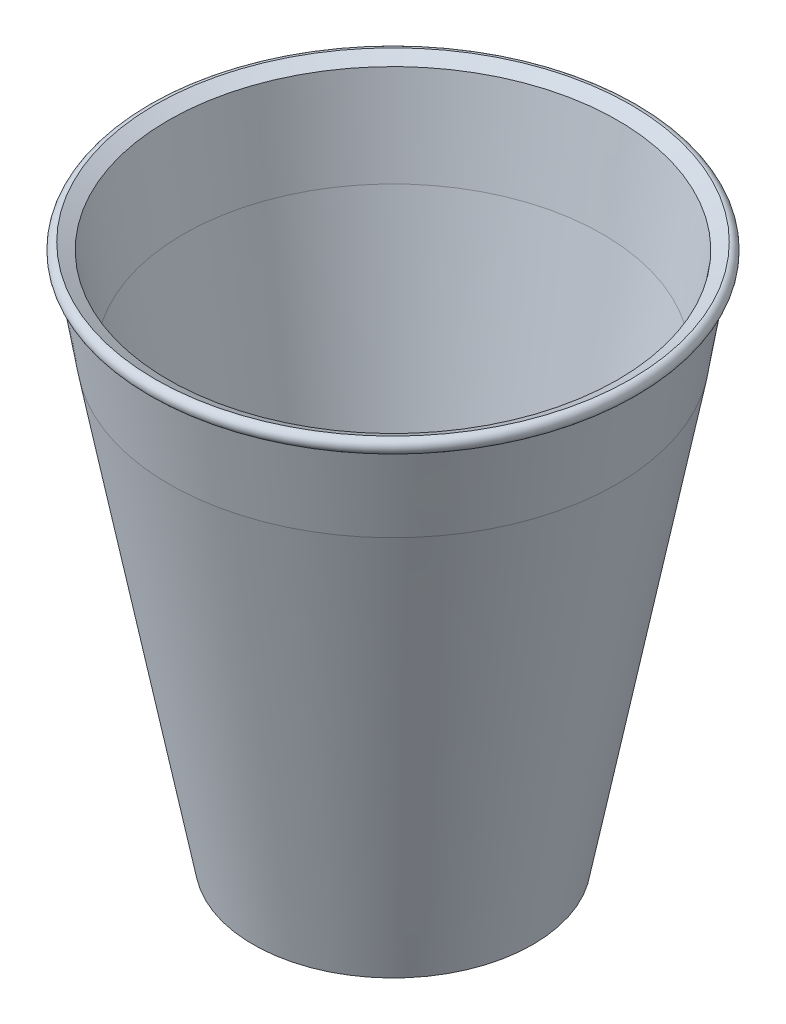
ISO-10303-21;
HEADER;
FILE_DESCRIPTION(('STEP AP214'),'2;1');
FILE_NAME('part.step','',(''),(''),'','','');
FILE_SCHEMA(('AUTOMOTIVE_DESIGN { 1 0 10303 214 1 1 1 1 }'));
ENDSEC;
DATA;
#1=APPLICATION_CONTEXT('core data for automotive mechanical design processes');
#2=APPLICATION_PROTOCOL_DEFINITION('international standard','automotive_design',2000,#1);
#3=PRODUCT_CONTEXT('',#1,'mechanical');
#4=PRODUCT('Part','Part','',(#3));
#5=PRODUCT_RELATED_PRODUCT_CATEGORY('part','',(#4));
#6=PRODUCT_DEFINITION_FORMATION('','',#4);
#7=PRODUCT_DEFINITION_CONTEXT('part definition',#1,'design');
#8=PRODUCT_DEFINITION('design','',#6,#7);
#9=PRODUCT_DEFINITION_SHAPE('','',#8);
#10=(LENGTH_UNIT() NAMED_UNIT(*) SI_UNIT(.MILLI.,.METRE.));
#11=(NAMED_UNIT(*) PLANE_ANGLE_UNIT() SI_UNIT($,.RADIAN.));
#12=(NAMED_UNIT(*) SI_UNIT($,.STERADIAN.) SOLID_ANGLE_UNIT());
#13=UNCERTAINTY_MEASURE_WITH_UNIT(LENGTH_MEASURE(1.E-05),#10,'distance_accuracy_value','');
#14=(GEOMETRIC_REPRESENTATION_CONTEXT(3) GLOBAL_UNCERTAINTY_ASSIGNED_CONTEXT((#13)) GLOBAL_UNIT_ASSIGNED_CONTEXT((#10,
#11,#12)) REPRESENTATION_CONTEXT('',''));
#15=CARTESIAN_POINT('',(0.,0.,0.));
#16=DIRECTION('',(0.,0.,1.));
#17=DIRECTION('',(1.,0.,0.));
#18=AXIS2_PLACEMENT_3D('',#15,#16,#17);
#19=CARTESIAN_POINT('',(-12.6,-75.97,0.));
#20=DIRECTION('',(0.,-1.,0.));
#21=DIRECTION('',(1.,0.,0.));
#22=AXIS2_PLACEMENT_3D('',#19,#20,#21);
#23=PLANE('',#22);
#24=CARTESIAN_POINT('',(0.,-75.97,0.));
#25=DIRECTION('',(0.,1.,0.));
#26=DIRECTION('',(-1.,0.,0.));
#27=AXIS2_PLACEMENT_3D('',#24,#25,#26);
#28=CIRCLE('',#27,12.6);
#29=CARTESIAN_POINT('',(-12.6,-75.97,0.));
#30=VERTEX_POINT('',#29);
#31=EDGE_CURVE('E10',#30,#30,#28,.T.);
#32=ORIENTED_EDGE('',*,*,#31,.F.);
#33=EDGE_LOOP('',(#32));
#34=FACE_BOUND('',#33,.T.);
#35=ADVANCED_FACE('F41',(#34),#23,.T.);
#36=CARTESIAN_POINT('',(0.,0.,0.));
#37=DIRECTION('',(0.,1.,0.));
#38=DIRECTION('',(-1.,0.,0.));
#39=AXIS2_PLACEMENT_3D('',#36,#37,#38);
#40=CYLINDRICAL_SURFACE('',#39,12.6);
#41=ORIENTED_EDGE('',*,*,#31,.T.);
#42=EDGE_LOOP('',(#41));
#43=FACE_BOUND('',#42,.T.);
#44=CARTESIAN_POINT('',(0.,-77.,0.));
#45=DIRECTION('',(0.,1.,0.));
#46=DIRECTION('',(-1.,0.,0.));
#47=AXIS2_PLACEMENT_3D('',#44,#45,#46);
#48=CIRCLE('',#47,12.6);
#49=CARTESIAN_POINT('',(-12.6,-77.,0.));
#50=VERTEX_POINT('',#49);
#51=EDGE_CURVE('E48',#50,#50,#48,.T.);
#52=ORIENTED_EDGE('',*,*,#51,.F.);
#53=EDGE_LOOP('',(#52));
#54=FACE_BOUND('',#53,.T.);
#55=ADVANCED_FACE('F101',(#43,#54),#40,.F.);
#56=CARTESIAN_POINT('',(-20.,-77.,0.));
#57=DIRECTION('',(0.,-1.,0.));
#58=DIRECTION('',(1.,0.,0.));
#59=AXIS2_PLACEMENT_3D('',#56,#57,#58);
#60=PLANE('',#59);
#61=ORIENTED_EDGE('',*,*,#51,.T.);
#62=EDGE_LOOP('',(#61));
#63=FACE_BOUND('',#62,.T.);
#64=CARTESIAN_POINT('',(0.,-77.,0.));
#65=DIRECTION('',(0.,1.,0.));
#66=DIRECTION('',(-1.,0.,0.));
#67=AXIS2_PLACEMENT_3D('',#64,#65,#66);
#68=CIRCLE('',#67,20.);
#69=CARTESIAN_POINT('',(-20.,-77.,0.));
#70=VERTEX_POINT('',#69);
#71=EDGE_CURVE('E53',#70,#70,#68,.T.);
#72=ORIENTED_EDGE('',*,*,#71,.F.);
#73=EDGE_LOOP('',(#72));
#74=FACE_BOUND('',#73,.T.);
#75=ADVANCED_FACE('F106',(#63,#74),#60,.T.);
#76=CARTESIAN_POINT('',(0.,-14.,0.));
#77=DIRECTION('',(0.,1.,0.));
#78=DIRECTION('',(-1.,0.,0.));
#79=AXIS2_PLACEMENT_3D('',#76,#77,#78);
#80=CONICAL_SURFACE('',#79,32.,0.188221505304771);
#81=ORIENTED_EDGE('',*,*,#71,.T.);
#82=EDGE_LOOP('',(#81));
#83=FACE_BOUND('',#82,.T.);
#84=CARTESIAN_POINT('',(0.,-14.,0.));
#85=DIRECTION('',(0.,1.,0.));
#86=DIRECTION('',(-1.,0.,0.));
#87=AXIS2_PLACEMENT_3D('',#84,#85,#86);
#88=CIRCLE('',#87,32.);
#89=CARTESIAN_POINT('',(-32.,-14.,0.));
#90=VERTEX_POINT('',#89);
#91=EDGE_CURVE('E58',#90,#90,#88,.T.);
#92=ORIENTED_EDGE('',*,*,#91,.F.);
#93=EDGE_LOOP('',(#92));
#94=FACE_BOUND('',#93,.T.);
#95=ADVANCED_FACE('F110',(#83,#94),#80,.T.);
#96=CARTESIAN_POINT('',(0.,-2.,0.));
#97=DIRECTION('',(0.,1.,0.));
#98=DIRECTION('',(-1.,0.,0.));
#99=AXIS2_PLACEMENT_3D('',#96,#97,#98);
#100=CONICAL_SURFACE('',#99,34.,0.165148677414627);
#101=ORIENTED_EDGE('',*,*,#91,.T.);
#102=EDGE_LOOP('',(#101));
#103=FACE_BOUND('',#102,.T.);
#104=CARTESIAN_POINT('',(0.,-2.,0.));
#105=DIRECTION('',(0.,1.,0.));
#106=DIRECTION('',(-1.,0.,0.));
#107=AXIS2_PLACEMENT_3D('',#104,#105,#106);
#108=CIRCLE('',#107,34.);
#109=CARTESIAN_POINT('',(-34.,-2.,0.));
#110=VERTEX_POINT('',#109);
#111=EDGE_CURVE('E64',#110,#110,#108,.T.);
#112=ORIENTED_EDGE('',*,*,#111,.F.);
#113=EDGE_LOOP('',(#112));
#114=FACE_BOUND('',#113,.T.);
#115=ADVANCED_FACE('F116',(#103,#114),#100,.T.);
#116=CARTESIAN_POINT('',(0.,-0.999999999999996,0.));
#117=DIRECTION('',(0.,1.,0.));
#118=DIRECTION('',(-1.,0.,0.));
#119=AXIS2_PLACEMENT_3D('',#116,#117,#118);
#120=TOROIDAL_SURFACE('',#119,34.,1.);
#121=ORIENTED_EDGE('',*,*,#111,.T.);
#122=EDGE_LOOP('',(#121));
#123=FACE_BOUND('',#122,.T.);
#124=CARTESIAN_POINT('',(0.,0.,0.));
#125=DIRECTION('',(0.,1.,0.));
#126=DIRECTION('',(-1.,0.,0.));
#127=AXIS2_PLACEMENT_3D('',#124,#125,#126);
#128=CIRCLE('',#127,34.);
#129=CARTESIAN_POINT('',(-34.,0.,0.));
#130=VERTEX_POINT('',#129);
#131=EDGE_CURVE('E68',#130,#130,#128,.T.);
#132=ORIENTED_EDGE('',*,*,#131,.F.);
#133=EDGE_LOOP('',(#132));
#134=FACE_BOUND('',#133,.T.);
#135=ADVANCED_FACE('F120',(#123,#134),#120,.T.);
#136=CARTESIAN_POINT('',(0.,-0.999999999999995,0.));
#137=DIRECTION('',(0.,1.,0.));
#138=DIRECTION('',(-1.,0.,0.));
#139=AXIS2_PLACEMENT_3D('',#136,#137,#138);
#140=CONICAL_SURFACE('',#139,32.130708730816,1.07957178018462);
#141=ORIENTED_EDGE('',*,*,#131,.T.);
#142=EDGE_LOOP('',(#141));
#143=FACE_BOUND('',#142,.T.);
#144=CARTESIAN_POINT('',(0.,-0.999999999999995,0.));
#145=DIRECTION('',(0.,1.,0.));
#146=DIRECTION('',(-1.,0.,0.));
#147=AXIS2_PLACEMENT_3D('',#144,#145,#146);
#148=CIRCLE('',#147,32.130708730816);
#149=CARTESIAN_POINT('',(-32.130708730816,-0.999999999999999,0.));
#150=VERTEX_POINT('',#149);
#151=EDGE_CURVE('E72',#150,#150,#148,.T.);
#152=ORIENTED_EDGE('',*,*,#151,.F.);
#153=EDGE_LOOP('',(#152));
#154=FACE_BOUND('',#153,.T.);
#155=ADVANCED_FACE('F97',(#143,#154),#140,.F.);
#156=CARTESIAN_POINT('',(0.,-14.,0.));
#157=DIRECTION('',(0.,1.,0.));
#158=DIRECTION('',(-1.,0.,0.));
#159=AXIS2_PLACEMENT_3D('',#156,#157,#158);
#160=CONICAL_SURFACE('',#159,29.9640420641493,0.165148677414627);
#161=ORIENTED_EDGE('',*,*,#151,.T.);
#162=EDGE_LOOP('',(#161));
#163=FACE_BOUND('',#162,.T.);
#164=CARTESIAN_POINT('',(0.,-14.,0.));
#165=DIRECTION('',(0.,1.,0.));
#166=DIRECTION('',(-1.,0.,0.));
#167=AXIS2_PLACEMENT_3D('',#164,#165,#166);
#168=CIRCLE('',#167,29.9640420641493);
#169=CARTESIAN_POINT('',(-29.9640420641493,-14.,0.));
#170=VERTEX_POINT('',#169);
#171=EDGE_CURVE('E76',#170,#170,#168,.T.);
#172=ORIENTED_EDGE('',*,*,#171,.F.);
#173=EDGE_LOOP('',(#172));
#174=FACE_BOUND('',#173,.T.);
#175=ADVANCED_FACE('F89',(#163,#174),#160,.F.);
#176=CARTESIAN_POINT('',(0.,-74.,0.));
#177=DIRECTION('',(0.,1.,0.));
#178=DIRECTION('',(-1.,0.,0.));
#179=AXIS2_PLACEMENT_3D('',#176,#177,#178);
#180=CONICAL_SURFACE('',#179,18.5354706355779,0.188221505304771);
#181=ORIENTED_EDGE('',*,*,#171,.T.);
#182=EDGE_LOOP('',(#181));
#183=FACE_BOUND('',#182,.T.);
#184=CARTESIAN_POINT('',(0.,-74.,0.));
#185=DIRECTION('',(0.,1.,0.));
#186=DIRECTION('',(-1.,0.,0.));
#187=AXIS2_PLACEMENT_3D('',#184,#185,#186);
#188=CIRCLE('',#187,18.5354706355779);
#189=CARTESIAN_POINT('',(-18.5354706355779,-74.,0.));
#190=VERTEX_POINT('',#189);
#191=EDGE_CURVE('E80',#190,#190,#188,.T.);
#192=ORIENTED_EDGE('',*,*,#191,.F.);
#193=EDGE_LOOP('',(#192));
#194=FACE_BOUND('',#193,.T.);
#195=ADVANCED_FACE('F87',(#183,#194),#180,.F.);
#196=CARTESIAN_POINT('',(0.,-74.,0.));
#197=DIRECTION('',(0.,1.,0.));
#198=DIRECTION('',(-1.,0.,0.));
#199=AXIS2_PLACEMENT_3D('',#196,#197,#198);
#200=PLANE('',#199);
#201=ORIENTED_EDGE('',*,*,#191,.T.);
#202=EDGE_LOOP('',(#201));
#203=FACE_BOUND('',#202,.T.);
#204=ADVANCED_FACE('F85',(#203),#200,.T.);
#205=CLOSED_SHELL('',(#35,#55,#75,#95,#115,#135,#155,#175,#195,#204));
#206=MANIFOLD_SOLID_BREP('B2',#205);
#207=ADVANCED_BREP_SHAPE_REPRESENTATION('',(#18,#206),#14);
#208=SHAPE_DEFINITION_REPRESENTATION(#9,#207);
ENDSEC;
END-ISO-10303-21;
